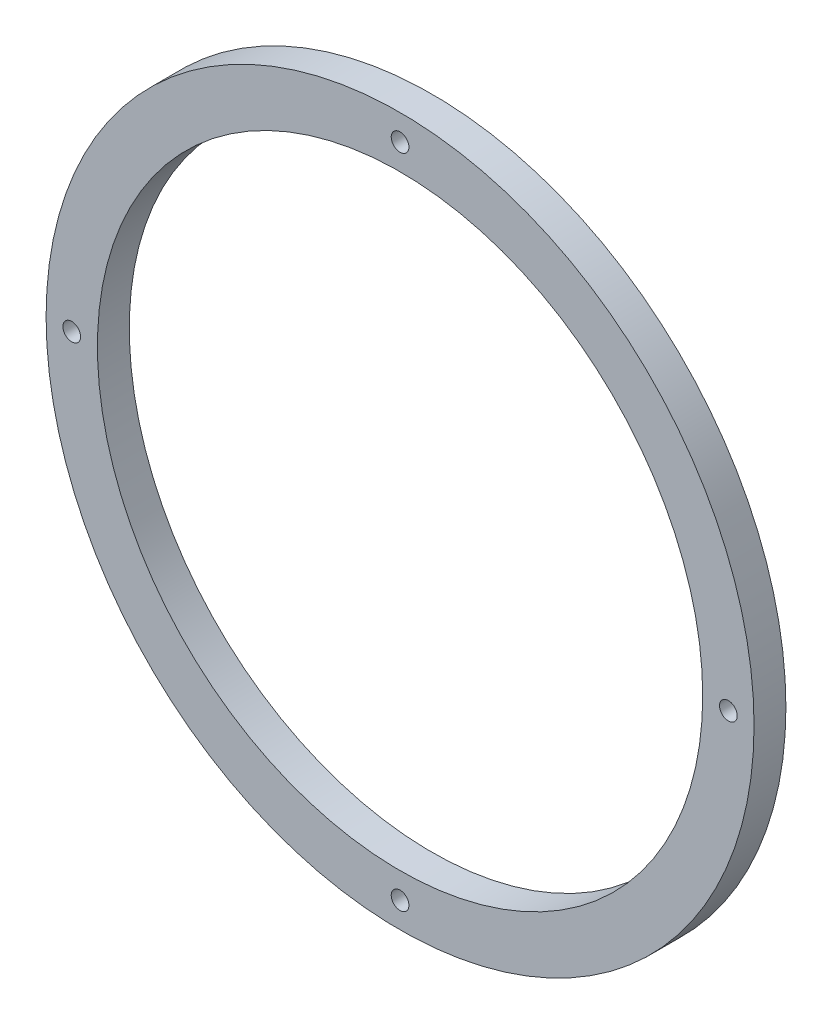
ISO-10303-21;
HEADER;
FILE_DESCRIPTION(('STEP AP214'),'2;1');
FILE_NAME('part.step','',(''),(''),'','','');
FILE_SCHEMA(('AUTOMOTIVE_DESIGN { 1 0 10303 214 1 1 1 1 }'));
ENDSEC;
DATA;
#1=APPLICATION_CONTEXT('core data for automotive mechanical design processes');
#2=APPLICATION_PROTOCOL_DEFINITION('international standard','automotive_design',2000,#1);
#3=PRODUCT_CONTEXT('',#1,'mechanical');
#4=PRODUCT('Part','Part','',(#3));
#5=PRODUCT_RELATED_PRODUCT_CATEGORY('part','',(#4));
#6=PRODUCT_DEFINITION_FORMATION('','',#4);
#7=PRODUCT_DEFINITION_CONTEXT('part definition',#1,'design');
#8=PRODUCT_DEFINITION('design','',#6,#7);
#9=PRODUCT_DEFINITION_SHAPE('','',#8);
#10=(LENGTH_UNIT() NAMED_UNIT(*) SI_UNIT(.MILLI.,.METRE.));
#11=(NAMED_UNIT(*) PLANE_ANGLE_UNIT() SI_UNIT($,.RADIAN.));
#12=(NAMED_UNIT(*) SI_UNIT($,.STERADIAN.) SOLID_ANGLE_UNIT());
#13=UNCERTAINTY_MEASURE_WITH_UNIT(LENGTH_MEASURE(1.E-05),#10,'distance_accuracy_value','');
#14=(GEOMETRIC_REPRESENTATION_CONTEXT(3) GLOBAL_UNCERTAINTY_ASSIGNED_CONTEXT((#13)) GLOBAL_UNIT_ASSIGNED_CONTEXT((#10,
#11,#12)) REPRESENTATION_CONTEXT('',''));
#15=CARTESIAN_POINT('',(0.,0.,0.));
#16=DIRECTION('',(0.,0.,1.));
#17=DIRECTION('',(1.,0.,0.));
#18=AXIS2_PLACEMENT_3D('',#15,#16,#17);
#19=CARTESIAN_POINT('',(0.,0.,9.));
#20=DIRECTION('',(0.,0.,1.));
#21=DIRECTION('',(1.,0.,0.));
#22=AXIS2_PLACEMENT_3D('',#19,#20,#21);
#23=PLANE('',#22);
#24=CARTESIAN_POINT('',(0.,92.75,9.));
#25=DIRECTION('',(0.,0.,1.));
#26=DIRECTION('',(1.,0.,0.));
#27=AXIS2_PLACEMENT_3D('',#24,#25,#26);
#28=CIRCLE('',#27,2.5);
#29=CARTESIAN_POINT('',(2.5,92.75,9.));
#30=VERTEX_POINT('',#29);
#31=EDGE_CURVE('E70',#30,#30,#28,.T.);
#32=ORIENTED_EDGE('',*,*,#31,.F.);
#33=EDGE_LOOP('',(#32));
#34=FACE_BOUND('',#33,.T.);
#35=CARTESIAN_POINT('',(92.7500000000026,2.61907565107683E-12,9.));
#36=DIRECTION('',(0.,0.,1.));
#37=DIRECTION('',(1.,0.,0.));
#38=AXIS2_PLACEMENT_3D('',#35,#36,#37);
#39=CIRCLE('',#38,2.50000000000205);
#40=CARTESIAN_POINT('',(95.2500000000047,2.61907565107683E-12,9.));
#41=VERTEX_POINT('',#40);
#42=EDGE_CURVE('E64',#41,#41,#39,.T.);
#43=ORIENTED_EDGE('',*,*,#42,.F.);
#44=EDGE_LOOP('',(#43));
#45=FACE_BOUND('',#44,.T.);
#46=CARTESIAN_POINT('',(5.23815130215367E-12,-92.75,9.));
#47=DIRECTION('',(0.,0.,1.));
#48=DIRECTION('',(1.,0.,0.));
#49=AXIS2_PLACEMENT_3D('',#46,#47,#48);
#50=CIRCLE('',#49,2.50000000000563);
#51=CARTESIAN_POINT('',(2.50000000001087,-92.75,9.));
#52=VERTEX_POINT('',#51);
#53=EDGE_CURVE('E58',#52,#52,#50,.T.);
#54=ORIENTED_EDGE('',*,*,#53,.F.);
#55=EDGE_LOOP('',(#54));
#56=FACE_BOUND('',#55,.T.);
#57=CARTESIAN_POINT('',(-92.7499999999974,-2.63043425013893E-12,9.));
#58=DIRECTION('',(0.,0.,1.));
#59=DIRECTION('',(1.,0.,0.));
#60=AXIS2_PLACEMENT_3D('',#57,#58,#59);
#61=CIRCLE('',#60,2.50000000000421);
#62=CARTESIAN_POINT('',(-90.2499999999932,-2.63043425013893E-12,9.));
#63=VERTEX_POINT('',#62);
#64=EDGE_CURVE('E52',#63,#63,#61,.T.);
#65=ORIENTED_EDGE('',*,*,#64,.F.);
#66=EDGE_LOOP('',(#65));
#67=FACE_BOUND('',#66,.T.);
#68=CARTESIAN_POINT('',(0.,0.,9.));
#69=DIRECTION('',(0.,0.,1.));
#70=DIRECTION('',(1.,0.,0.));
#71=AXIS2_PLACEMENT_3D('',#68,#69,#70);
#72=CIRCLE('',#71,100.);
#73=CARTESIAN_POINT('',(100.,0.,9.));
#74=VERTEX_POINT('',#73);
#75=EDGE_CURVE('E10',#74,#74,#72,.T.);
#76=ORIENTED_EDGE('',*,*,#75,.T.);
#77=EDGE_LOOP('',(#76));
#78=FACE_BOUND('',#77,.T.);
#79=CARTESIAN_POINT('',(0.,0.,9.));
#80=DIRECTION('',(0.,0.,1.));
#81=DIRECTION('',(1.,0.,0.));
#82=AXIS2_PLACEMENT_3D('',#79,#80,#81);
#83=CIRCLE('',#82,85.5);
#84=CARTESIAN_POINT('',(85.5,0.,9.));
#85=VERTEX_POINT('',#84);
#86=EDGE_CURVE('E44',#85,#85,#83,.T.);
#87=ORIENTED_EDGE('',*,*,#86,.F.);
#88=EDGE_LOOP('',(#87));
#89=FACE_BOUND('',#88,.T.);
#90=ADVANCED_FACE('F33',(#34,#45,#56,#67,#78,#89),#23,.T.);
#91=CARTESIAN_POINT('',(0.,0.,0.));
#92=DIRECTION('',(0.,0.,1.));
#93=DIRECTION('',(1.,0.,0.));
#94=AXIS2_PLACEMENT_3D('',#91,#92,#93);
#95=PLANE('',#94);
#96=CARTESIAN_POINT('',(0.,92.75,0.));
#97=DIRECTION('',(0.,0.,1.));
#98=DIRECTION('',(1.,0.,0.));
#99=AXIS2_PLACEMENT_3D('',#96,#97,#98);
#100=CIRCLE('',#99,2.5);
#101=CARTESIAN_POINT('',(2.5,92.75,0.));
#102=VERTEX_POINT('',#101);
#103=EDGE_CURVE('E49',#102,#102,#100,.T.);
#104=ORIENTED_EDGE('',*,*,#103,.T.);
#105=EDGE_LOOP('',(#104));
#106=FACE_BOUND('',#105,.T.);
#107=CARTESIAN_POINT('',(92.7500000000026,2.61907565107683E-12,0.));
#108=DIRECTION('',(0.,0.,1.));
#109=DIRECTION('',(1.,0.,0.));
#110=AXIS2_PLACEMENT_3D('',#107,#108,#109);
#111=CIRCLE('',#110,2.50000000000205);
#112=CARTESIAN_POINT('',(95.2500000000047,2.61907565107683E-12,0.));
#113=VERTEX_POINT('',#112);
#114=EDGE_CURVE('E67',#113,#113,#111,.T.);
#115=ORIENTED_EDGE('',*,*,#114,.T.);
#116=EDGE_LOOP('',(#115));
#117=FACE_BOUND('',#116,.T.);
#118=CARTESIAN_POINT('',(5.23815130215367E-12,-92.75,0.));
#119=DIRECTION('',(0.,0.,1.));
#120=DIRECTION('',(1.,0.,0.));
#121=AXIS2_PLACEMENT_3D('',#118,#119,#120);
#122=CIRCLE('',#121,2.50000000000563);
#123=CARTESIAN_POINT('',(2.50000000001087,-92.75,0.));
#124=VERTEX_POINT('',#123);
#125=EDGE_CURVE('E61',#124,#124,#122,.T.);
#126=ORIENTED_EDGE('',*,*,#125,.T.);
#127=EDGE_LOOP('',(#126));
#128=FACE_BOUND('',#127,.T.);
#129=CARTESIAN_POINT('',(-92.7499999999974,-2.63043425013893E-12,0.));
#130=DIRECTION('',(0.,0.,1.));
#131=DIRECTION('',(1.,0.,0.));
#132=AXIS2_PLACEMENT_3D('',#129,#130,#131);
#133=CIRCLE('',#132,2.50000000000421);
#134=CARTESIAN_POINT('',(-90.2499999999932,-2.63043425013893E-12,0.));
#135=VERTEX_POINT('',#134);
#136=EDGE_CURVE('E55',#135,#135,#133,.T.);
#137=ORIENTED_EDGE('',*,*,#136,.T.);
#138=EDGE_LOOP('',(#137));
#139=FACE_BOUND('',#138,.T.);
#140=CARTESIAN_POINT('',(0.,0.,0.));
#141=DIRECTION('',(0.,0.,1.));
#142=DIRECTION('',(1.,0.,0.));
#143=AXIS2_PLACEMENT_3D('',#140,#141,#142);
#144=CIRCLE('',#143,100.);
#145=CARTESIAN_POINT('',(100.,0.,0.));
#146=VERTEX_POINT('',#145);
#147=EDGE_CURVE('E37',#146,#146,#144,.T.);
#148=ORIENTED_EDGE('',*,*,#147,.F.);
#149=EDGE_LOOP('',(#148));
#150=FACE_BOUND('',#149,.T.);
#151=CARTESIAN_POINT('',(0.,0.,0.));
#152=DIRECTION('',(0.,0.,1.));
#153=DIRECTION('',(1.,0.,0.));
#154=AXIS2_PLACEMENT_3D('',#151,#152,#153);
#155=CIRCLE('',#154,85.5);
#156=CARTESIAN_POINT('',(85.5,0.,0.));
#157=VERTEX_POINT('',#156);
#158=EDGE_CURVE('E46',#157,#157,#155,.T.);
#159=ORIENTED_EDGE('',*,*,#158,.T.);
#160=EDGE_LOOP('',(#159));
#161=FACE_BOUND('',#160,.T.);
#162=ADVANCED_FACE('F76',(#106,#117,#128,#139,#150,#161),#95,.F.);
#163=CARTESIAN_POINT('',(0.,0.,9.));
#164=DIRECTION('',(0.,0.,-1.));
#165=DIRECTION('',(-1.,0.,0.));
#166=AXIS2_PLACEMENT_3D('',#163,#164,#165);
#167=CYLINDRICAL_SURFACE('',#166,100.);
#168=ORIENTED_EDGE('',*,*,#75,.F.);
#169=EDGE_LOOP('',(#168));
#170=FACE_BOUND('',#169,.T.);
#171=ORIENTED_EDGE('',*,*,#147,.T.);
#172=EDGE_LOOP('',(#171));
#173=FACE_BOUND('',#172,.T.);
#174=ADVANCED_FACE('F35',(#170,#173),#167,.T.);
#175=CARTESIAN_POINT('',(0.,0.,9.));
#176=DIRECTION('',(0.,0.,-1.));
#177=DIRECTION('',(-1.,0.,0.));
#178=AXIS2_PLACEMENT_3D('',#175,#176,#177);
#179=CYLINDRICAL_SURFACE('',#178,85.5);
#180=ORIENTED_EDGE('',*,*,#86,.T.);
#181=EDGE_LOOP('',(#180));
#182=FACE_BOUND('',#181,.T.);
#183=ORIENTED_EDGE('',*,*,#158,.F.);
#184=EDGE_LOOP('',(#183));
#185=FACE_BOUND('',#184,.T.);
#186=ADVANCED_FACE('F97',(#182,#185),#179,.F.);
#187=CARTESIAN_POINT('',(-92.7499999999974,-2.63043425013893E-12,0.));
#188=DIRECTION('',(0.,0.,1.));
#189=DIRECTION('',(1.,0.,0.));
#190=AXIS2_PLACEMENT_3D('',#187,#188,#189);
#191=CYLINDRICAL_SURFACE('',#190,2.50000000000421);
#192=ORIENTED_EDGE('',*,*,#136,.F.);
#193=EDGE_LOOP('',(#192));
#194=FACE_BOUND('',#193,.T.);
#195=ORIENTED_EDGE('',*,*,#64,.T.);
#196=EDGE_LOOP('',(#195));
#197=FACE_BOUND('',#196,.T.);
#198=ADVANCED_FACE('F100',(#194,#197),#191,.F.);
#199=CARTESIAN_POINT('',(5.23815130215367E-12,-92.75,0.));
#200=DIRECTION('',(0.,0.,1.));
#201=DIRECTION('',(1.,0.,0.));
#202=AXIS2_PLACEMENT_3D('',#199,#200,#201);
#203=CYLINDRICAL_SURFACE('',#202,2.50000000000563);
#204=ORIENTED_EDGE('',*,*,#125,.F.);
#205=EDGE_LOOP('',(#204));
#206=FACE_BOUND('',#205,.T.);
#207=ORIENTED_EDGE('',*,*,#53,.T.);
#208=EDGE_LOOP('',(#207));
#209=FACE_BOUND('',#208,.T.);
#210=ADVANCED_FACE('F113',(#206,#209),#203,.F.);
#211=CARTESIAN_POINT('',(92.7500000000026,2.61907565107683E-12,0.));
#212=DIRECTION('',(0.,0.,1.));
#213=DIRECTION('',(1.,0.,0.));
#214=AXIS2_PLACEMENT_3D('',#211,#212,#213);
#215=CYLINDRICAL_SURFACE('',#214,2.50000000000205);
#216=ORIENTED_EDGE('',*,*,#114,.F.);
#217=EDGE_LOOP('',(#216));
#218=FACE_BOUND('',#217,.T.);
#219=ORIENTED_EDGE('',*,*,#42,.T.);
#220=EDGE_LOOP('',(#219));
#221=FACE_BOUND('',#220,.T.);
#222=ADVANCED_FACE('F82',(#218,#221),#215,.F.);
#223=CARTESIAN_POINT('',(0.,92.75,0.));
#224=DIRECTION('',(0.,0.,1.));
#225=DIRECTION('',(1.,0.,0.));
#226=AXIS2_PLACEMENT_3D('',#223,#224,#225);
#227=CYLINDRICAL_SURFACE('',#226,2.5);
#228=ORIENTED_EDGE('',*,*,#103,.F.);
#229=EDGE_LOOP('',(#228));
#230=FACE_BOUND('',#229,.T.);
#231=ORIENTED_EDGE('',*,*,#31,.T.);
#232=EDGE_LOOP('',(#231));
#233=FACE_BOUND('',#232,.T.);
#234=ADVANCED_FACE('F79',(#230,#233),#227,.F.);
#235=CLOSED_SHELL('',(#90,#162,#174,#186,#198,#210,#222,#234));
#236=MANIFOLD_SOLID_BREP('B2',#235);
#237=ADVANCED_BREP_SHAPE_REPRESENTATION('',(#18,#236),#14);
#238=SHAPE_DEFINITION_REPRESENTATION(#9,#237);
ENDSEC;
END-ISO-10303-21;
